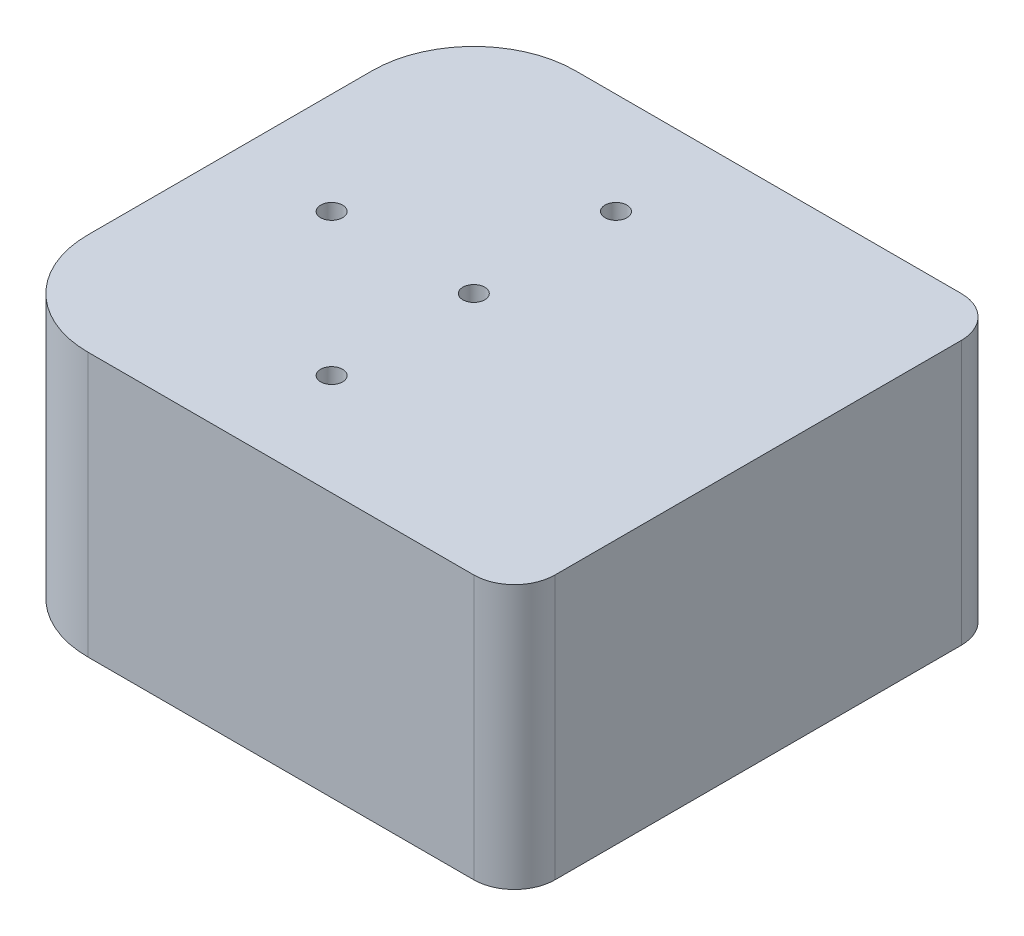
ISO-10303-21;
HEADER;
FILE_DESCRIPTION(('STEP AP214'),'2;1');
FILE_NAME('part.step','',(''),(''),'','','');
FILE_SCHEMA(('AUTOMOTIVE_DESIGN { 1 0 10303 214 1 1 1 1 }'));
ENDSEC;
DATA;
#1=APPLICATION_CONTEXT('core data for automotive mechanical design processes');
#2=APPLICATION_PROTOCOL_DEFINITION('international standard','automotive_design',2000,#1);
#3=PRODUCT_CONTEXT('',#1,'mechanical');
#4=PRODUCT('Part','Part','',(#3));
#5=PRODUCT_RELATED_PRODUCT_CATEGORY('part','',(#4));
#6=PRODUCT_DEFINITION_FORMATION('','',#4);
#7=PRODUCT_DEFINITION_CONTEXT('part definition',#1,'design');
#8=PRODUCT_DEFINITION('design','',#6,#7);
#9=PRODUCT_DEFINITION_SHAPE('','',#8);
#10=(LENGTH_UNIT() NAMED_UNIT(*) SI_UNIT(.MILLI.,.METRE.));
#11=(NAMED_UNIT(*) PLANE_ANGLE_UNIT() SI_UNIT($,.RADIAN.));
#12=(NAMED_UNIT(*) SI_UNIT($,.STERADIAN.) SOLID_ANGLE_UNIT());
#13=UNCERTAINTY_MEASURE_WITH_UNIT(LENGTH_MEASURE(1.E-05),#10,'distance_accuracy_value','');
#14=(GEOMETRIC_REPRESENTATION_CONTEXT(3) GLOBAL_UNCERTAINTY_ASSIGNED_CONTEXT((#13)) GLOBAL_UNIT_ASSIGNED_CONTEXT((#10,
#11,#12)) REPRESENTATION_CONTEXT('',''));
#15=CARTESIAN_POINT('',(0.,0.,0.));
#16=DIRECTION('',(0.,0.,1.));
#17=DIRECTION('',(1.,0.,0.));
#18=AXIS2_PLACEMENT_3D('',#15,#16,#17);
#19=CARTESIAN_POINT('',(-7.,13.,7.));
#20=DIRECTION('',(0.,-1.,0.));
#21=DIRECTION('',(0.,0.,-1.));
#22=AXIS2_PLACEMENT_3D('',#19,#20,#21);
#23=PLANE('',#22);
#24=CARTESIAN_POINT('',(0.,13.,-7.));
#25=DIRECTION('',(0.,1.,0.));
#26=DIRECTION('',(0.,0.,1.));
#27=AXIS2_PLACEMENT_3D('',#24,#25,#26);
#28=CIRCLE('',#27,0.54);
#29=CARTESIAN_POINT('',(0.,13.,-6.46));
#30=VERTEX_POINT('',#29);
#31=EDGE_CURVE('E188',#30,#30,#28,.T.);
#32=ORIENTED_EDGE('',*,*,#31,.F.);
#33=EDGE_LOOP('',(#32));
#34=FACE_BOUND('',#33,.T.);
#35=CARTESIAN_POINT('',(0.,13.,0.));
#36=DIRECTION('',(0.,1.,0.));
#37=DIRECTION('',(0.,0.,1.));
#38=AXIS2_PLACEMENT_3D('',#35,#36,#37);
#39=CIRCLE('',#38,0.54);
#40=CARTESIAN_POINT('',(0.,13.,0.54));
#41=VERTEX_POINT('',#40);
#42=EDGE_CURVE('E134',#41,#41,#39,.T.);
#43=ORIENTED_EDGE('',*,*,#42,.F.);
#44=EDGE_LOOP('',(#43));
#45=FACE_BOUND('',#44,.T.);
#46=CARTESIAN_POINT('',(-7.,13.,7.));
#47=DIRECTION('',(0.,1.,0.));
#48=DIRECTION('',(0.,0.,-1.));
#49=AXIS2_PLACEMENT_3D('',#46,#47,#48);
#50=CIRCLE('',#49,5.);
#51=CARTESIAN_POINT('',(-12.,13.,6.99999999999996));
#52=VERTEX_POINT('',#51);
#53=CARTESIAN_POINT('',(-6.99999999999996,13.,12.));
#54=VERTEX_POINT('',#53);
#55=EDGE_CURVE('E145',#52,#54,#50,.T.);
#56=ORIENTED_EDGE('',*,*,#55,.T.);
#57=DIRECTION('',(1.,0.,0.));
#58=VECTOR('',#57,1.);
#59=CARTESIAN_POINT('',(-6.99999999999996,13.,12.));
#60=LINE('',#59,#58);
#61=CARTESIAN_POINT('',(12.,13.,12.));
#62=VERTEX_POINT('',#61);
#63=EDGE_CURVE('E93',#54,#62,#60,.T.);
#64=ORIENTED_EDGE('',*,*,#63,.T.);
#65=CARTESIAN_POINT('',(12.,13.,10.));
#66=DIRECTION('',(0.,1.,0.));
#67=DIRECTION('',(0.,0.,1.));
#68=AXIS2_PLACEMENT_3D('',#65,#66,#67);
#69=CIRCLE('',#68,2.);
#70=CARTESIAN_POINT('',(14.,13.,9.99999999999998));
#71=VERTEX_POINT('',#70);
#72=EDGE_CURVE('E160',#62,#71,#69,.T.);
#73=ORIENTED_EDGE('',*,*,#72,.T.);
#74=DIRECTION('',(0.,0.,-1.));
#75=VECTOR('',#74,1.);
#76=CARTESIAN_POINT('',(14.,13.,-9.99999999999999));
#77=LINE('',#76,#75);
#78=CARTESIAN_POINT('',(14.,13.,-9.99999999999999));
#79=VERTEX_POINT('',#78);
#80=EDGE_CURVE('E173',#71,#79,#77,.T.);
#81=ORIENTED_EDGE('',*,*,#80,.T.);
#82=CARTESIAN_POINT('',(12.,13.,-10.));
#83=DIRECTION('',(0.,1.,0.));
#84=DIRECTION('',(0.,0.,-1.));
#85=AXIS2_PLACEMENT_3D('',#82,#83,#84);
#86=CIRCLE('',#85,2.);
#87=CARTESIAN_POINT('',(12.,13.,-12.));
#88=VERTEX_POINT('',#87);
#89=EDGE_CURVE('E112',#79,#88,#86,.T.);
#90=ORIENTED_EDGE('',*,*,#89,.T.);
#91=DIRECTION('',(-1.,0.,0.));
#92=VECTOR('',#91,1.);
#93=CARTESIAN_POINT('',(-6.99999999999997,13.,-12.));
#94=LINE('',#93,#92);
#95=CARTESIAN_POINT('',(-6.99999999999997,13.,-12.));
#96=VERTEX_POINT('',#95);
#97=EDGE_CURVE('E106',#88,#96,#94,.T.);
#98=ORIENTED_EDGE('',*,*,#97,.T.);
#99=CARTESIAN_POINT('',(-7.,13.,-7.));
#100=DIRECTION('',(0.,1.,0.));
#101=DIRECTION('',(0.,0.,-1.));
#102=AXIS2_PLACEMENT_3D('',#99,#100,#101);
#103=CIRCLE('',#102,5.);
#104=CARTESIAN_POINT('',(-12.,13.,-6.99999999999996));
#105=VERTEX_POINT('',#104);
#106=EDGE_CURVE('E110',#96,#105,#103,.T.);
#107=ORIENTED_EDGE('',*,*,#106,.T.);
#108=DIRECTION('',(0.,0.,1.));
#109=VECTOR('',#108,1.);
#110=CARTESIAN_POINT('',(-12.,13.,-6.99999999999996));
#111=LINE('',#110,#109);
#112=EDGE_CURVE('E50',#105,#52,#111,.T.);
#113=ORIENTED_EDGE('',*,*,#112,.T.);
#114=EDGE_LOOP('',(#56,#64,#73,#81,#90,#98,#107,#113));
#115=FACE_BOUND('',#114,.T.);
#116=CARTESIAN_POINT('',(-7.,13.,0.));
#117=DIRECTION('',(0.,1.,0.));
#118=DIRECTION('',(0.,0.,1.));
#119=AXIS2_PLACEMENT_3D('',#116,#117,#118);
#120=CIRCLE('',#119,0.54);
#121=CARTESIAN_POINT('',(-7.,13.,0.540000000000001));
#122=VERTEX_POINT('',#121);
#123=EDGE_CURVE('E182',#122,#122,#120,.T.);
#124=ORIENTED_EDGE('',*,*,#123,.F.);
#125=EDGE_LOOP('',(#124));
#126=FACE_BOUND('',#125,.T.);
#127=CARTESIAN_POINT('',(0.,13.,7.));
#128=DIRECTION('',(0.,1.,0.));
#129=DIRECTION('',(0.,0.,1.));
#130=AXIS2_PLACEMENT_3D('',#127,#128,#129);
#131=CIRCLE('',#130,0.54);
#132=CARTESIAN_POINT('',(0.,13.,7.54));
#133=VERTEX_POINT('',#132);
#134=EDGE_CURVE('E194',#133,#133,#131,.T.);
#135=ORIENTED_EDGE('',*,*,#134,.F.);
#136=EDGE_LOOP('',(#135));
#137=FACE_BOUND('',#136,.T.);
#138=ADVANCED_FACE('F33',(#34,#45,#115,#126,#137),#23,.F.);
#139=CARTESIAN_POINT('',(-7.,0.,7.));
#140=DIRECTION('',(0.,-1.,0.));
#141=DIRECTION('',(0.,0.,-1.));
#142=AXIS2_PLACEMENT_3D('',#139,#140,#141);
#143=PLANE('',#142);
#144=CARTESIAN_POINT('',(0.,0.,-7.));
#145=DIRECTION('',(0.,1.,0.));
#146=DIRECTION('',(0.,0.,1.));
#147=AXIS2_PLACEMENT_3D('',#144,#145,#146);
#148=CIRCLE('',#147,0.54);
#149=CARTESIAN_POINT('',(0.,0.,-6.46));
#150=VERTEX_POINT('',#149);
#151=EDGE_CURVE('E191',#150,#150,#148,.T.);
#152=ORIENTED_EDGE('',*,*,#151,.T.);
#153=EDGE_LOOP('',(#152));
#154=FACE_BOUND('',#153,.T.);
#155=CARTESIAN_POINT('',(0.,0.,0.));
#156=DIRECTION('',(0.,1.,0.));
#157=DIRECTION('',(0.,0.,1.));
#158=AXIS2_PLACEMENT_3D('',#155,#156,#157);
#159=CIRCLE('',#158,0.54);
#160=CARTESIAN_POINT('',(0.,0.,0.54));
#161=VERTEX_POINT('',#160);
#162=EDGE_CURVE('E179',#161,#161,#159,.T.);
#163=ORIENTED_EDGE('',*,*,#162,.T.);
#164=EDGE_LOOP('',(#163));
#165=FACE_BOUND('',#164,.T.);
#166=CARTESIAN_POINT('',(-7.,0.,7.));
#167=DIRECTION('',(0.,1.,0.));
#168=DIRECTION('',(0.,0.,-1.));
#169=AXIS2_PLACEMENT_3D('',#166,#167,#168);
#170=CIRCLE('',#169,5.);
#171=CARTESIAN_POINT('',(-12.,0.,6.99999999999996));
#172=VERTEX_POINT('',#171);
#173=CARTESIAN_POINT('',(-6.99999999999996,0.,12.));
#174=VERTEX_POINT('',#173);
#175=EDGE_CURVE('E130',#172,#174,#170,.T.);
#176=ORIENTED_EDGE('',*,*,#175,.F.);
#177=DIRECTION('',(0.,0.,1.));
#178=VECTOR('',#177,1.);
#179=CARTESIAN_POINT('',(-12.,0.,-6.99999999999996));
#180=LINE('',#179,#178);
#181=CARTESIAN_POINT('',(-12.,0.,-6.99999999999996));
#182=VERTEX_POINT('',#181);
#183=EDGE_CURVE('E85',#182,#172,#180,.T.);
#184=ORIENTED_EDGE('',*,*,#183,.F.);
#185=CARTESIAN_POINT('',(-7.,0.,-7.));
#186=DIRECTION('',(0.,1.,0.));
#187=DIRECTION('',(0.,0.,-1.));
#188=AXIS2_PLACEMENT_3D('',#185,#186,#187);
#189=CIRCLE('',#188,5.);
#190=CARTESIAN_POINT('',(-6.99999999999997,0.,-12.));
#191=VERTEX_POINT('',#190);
#192=EDGE_CURVE('E79',#191,#182,#189,.T.);
#193=ORIENTED_EDGE('',*,*,#192,.F.);
#194=DIRECTION('',(-1.,0.,0.));
#195=VECTOR('',#194,1.);
#196=CARTESIAN_POINT('',(-6.99999999999997,0.,-12.));
#197=LINE('',#196,#195);
#198=CARTESIAN_POINT('',(12.,0.,-12.));
#199=VERTEX_POINT('',#198);
#200=EDGE_CURVE('E120',#199,#191,#197,.T.);
#201=ORIENTED_EDGE('',*,*,#200,.F.);
#202=CARTESIAN_POINT('',(12.,0.,-10.));
#203=DIRECTION('',(0.,1.,0.));
#204=DIRECTION('',(0.,0.,-1.));
#205=AXIS2_PLACEMENT_3D('',#202,#203,#204);
#206=CIRCLE('',#205,2.);
#207=CARTESIAN_POINT('',(14.,0.,-9.99999999999999));
#208=VERTEX_POINT('',#207);
#209=EDGE_CURVE('E140',#208,#199,#206,.T.);
#210=ORIENTED_EDGE('',*,*,#209,.F.);
#211=DIRECTION('',(0.,0.,-1.));
#212=VECTOR('',#211,1.);
#213=CARTESIAN_POINT('',(14.,0.,-9.99999999999999));
#214=LINE('',#213,#212);
#215=CARTESIAN_POINT('',(14.,0.,9.99999999999998));
#216=VERTEX_POINT('',#215);
#217=EDGE_CURVE('E138',#216,#208,#214,.T.);
#218=ORIENTED_EDGE('',*,*,#217,.F.);
#219=CARTESIAN_POINT('',(12.,0.,10.));
#220=DIRECTION('',(0.,1.,0.));
#221=DIRECTION('',(0.,0.,1.));
#222=AXIS2_PLACEMENT_3D('',#219,#220,#221);
#223=CIRCLE('',#222,2.);
#224=CARTESIAN_POINT('',(12.,0.,12.));
#225=VERTEX_POINT('',#224);
#226=EDGE_CURVE('E136',#225,#216,#223,.T.);
#227=ORIENTED_EDGE('',*,*,#226,.F.);
#228=DIRECTION('',(1.,0.,0.));
#229=VECTOR('',#228,1.);
#230=CARTESIAN_POINT('',(-6.99999999999996,0.,12.));
#231=LINE('',#230,#229);
#232=EDGE_CURVE('E133',#174,#225,#231,.T.);
#233=ORIENTED_EDGE('',*,*,#232,.F.);
#234=EDGE_LOOP('',(#176,#184,#193,#201,#210,#218,#227,#233));
#235=FACE_BOUND('',#234,.T.);
#236=CARTESIAN_POINT('',(-7.,0.,0.));
#237=DIRECTION('',(0.,1.,0.));
#238=DIRECTION('',(0.,0.,1.));
#239=AXIS2_PLACEMENT_3D('',#236,#237,#238);
#240=CIRCLE('',#239,0.54);
#241=CARTESIAN_POINT('',(-7.,0.,0.540000000000001));
#242=VERTEX_POINT('',#241);
#243=EDGE_CURVE('E185',#242,#242,#240,.T.);
#244=ORIENTED_EDGE('',*,*,#243,.T.);
#245=EDGE_LOOP('',(#244));
#246=FACE_BOUND('',#245,.T.);
#247=CARTESIAN_POINT('',(0.,0.,7.));
#248=DIRECTION('',(0.,1.,0.));
#249=DIRECTION('',(0.,0.,1.));
#250=AXIS2_PLACEMENT_3D('',#247,#248,#249);
#251=CIRCLE('',#250,0.54);
#252=CARTESIAN_POINT('',(0.,0.,7.54));
#253=VERTEX_POINT('',#252);
#254=EDGE_CURVE('E197',#253,#253,#251,.T.);
#255=ORIENTED_EDGE('',*,*,#254,.T.);
#256=EDGE_LOOP('',(#255));
#257=FACE_BOUND('',#256,.T.);
#258=ADVANCED_FACE('F164',(#154,#165,#235,#246,#257),#143,.T.);
#259=CARTESIAN_POINT('',(-7.,13.,7.));
#260=DIRECTION('',(0.,-1.,0.));
#261=DIRECTION('',(0.,0.,-1.));
#262=AXIS2_PLACEMENT_3D('',#259,#260,#261);
#263=CYLINDRICAL_SURFACE('',#262,5.);
#264=ORIENTED_EDGE('',*,*,#175,.T.);
#265=DIRECTION('',(0.,-1.,0.));
#266=VECTOR('',#265,1.);
#267=CARTESIAN_POINT('',(-6.99999999999996,13.,12.));
#268=LINE('',#267,#266);
#269=EDGE_CURVE('E11',#54,#174,#268,.T.);
#270=ORIENTED_EDGE('',*,*,#269,.F.);
#271=ORIENTED_EDGE('',*,*,#55,.F.);
#272=DIRECTION('',(0.,-1.,0.));
#273=VECTOR('',#272,1.);
#274=CARTESIAN_POINT('',(-12.,13.,6.99999999999996));
#275=LINE('',#274,#273);
#276=EDGE_CURVE('E126',#52,#172,#275,.T.);
#277=ORIENTED_EDGE('',*,*,#276,.T.);
#278=EDGE_LOOP('',(#264,#270,#271,#277));
#279=FACE_BOUND('',#278,.T.);
#280=ADVANCED_FACE('F35',(#279),#263,.T.);
#281=CARTESIAN_POINT('',(-6.99999999999996,13.,12.));
#282=DIRECTION('',(0.,0.,-1.));
#283=DIRECTION('',(-1.,0.,0.));
#284=AXIS2_PLACEMENT_3D('',#281,#282,#283);
#285=PLANE('',#284);
#286=ORIENTED_EDGE('',*,*,#232,.T.);
#287=DIRECTION('',(0.,-1.,0.));
#288=VECTOR('',#287,1.);
#289=CARTESIAN_POINT('',(12.,13.,12.));
#290=LINE('',#289,#288);
#291=EDGE_CURVE('E42',#62,#225,#290,.T.);
#292=ORIENTED_EDGE('',*,*,#291,.F.);
#293=ORIENTED_EDGE('',*,*,#63,.F.);
#294=ORIENTED_EDGE('',*,*,#269,.T.);
#295=EDGE_LOOP('',(#286,#292,#293,#294));
#296=FACE_BOUND('',#295,.T.);
#297=ADVANCED_FACE('F232',(#296),#285,.F.);
#298=CARTESIAN_POINT('',(12.,13.,10.));
#299=DIRECTION('',(0.,-1.,0.));
#300=DIRECTION('',(0.,0.,-1.));
#301=AXIS2_PLACEMENT_3D('',#298,#299,#300);
#302=CYLINDRICAL_SURFACE('',#301,2.);
#303=ORIENTED_EDGE('',*,*,#226,.T.);
#304=DIRECTION('',(0.,-1.,0.));
#305=VECTOR('',#304,1.);
#306=CARTESIAN_POINT('',(14.,13.,9.99999999999998));
#307=LINE('',#306,#305);
#308=EDGE_CURVE('E152',#71,#216,#307,.T.);
#309=ORIENTED_EDGE('',*,*,#308,.F.);
#310=ORIENTED_EDGE('',*,*,#72,.F.);
#311=ORIENTED_EDGE('',*,*,#291,.T.);
#312=EDGE_LOOP('',(#303,#309,#310,#311));
#313=FACE_BOUND('',#312,.T.);
#314=ADVANCED_FACE('F158',(#313),#302,.T.);
#315=CARTESIAN_POINT('',(14.,13.,-9.99999999999999));
#316=DIRECTION('',(-1.,0.,0.));
#317=DIRECTION('',(0.,0.,1.));
#318=AXIS2_PLACEMENT_3D('',#315,#316,#317);
#319=PLANE('',#318);
#320=ORIENTED_EDGE('',*,*,#217,.T.);
#321=DIRECTION('',(0.,-1.,0.));
#322=VECTOR('',#321,1.);
#323=CARTESIAN_POINT('',(14.,13.,-9.99999999999999));
#324=LINE('',#323,#322);
#325=EDGE_CURVE('E149',#79,#208,#324,.T.);
#326=ORIENTED_EDGE('',*,*,#325,.F.);
#327=ORIENTED_EDGE('',*,*,#80,.F.);
#328=ORIENTED_EDGE('',*,*,#308,.T.);
#329=EDGE_LOOP('',(#320,#326,#327,#328));
#330=FACE_BOUND('',#329,.T.);
#331=ADVANCED_FACE('F169',(#330),#319,.F.);
#332=CARTESIAN_POINT('',(12.,13.,-10.));
#333=DIRECTION('',(0.,-1.,0.));
#334=DIRECTION('',(0.,0.,-1.));
#335=AXIS2_PLACEMENT_3D('',#332,#333,#334);
#336=CYLINDRICAL_SURFACE('',#335,2.);
#337=ORIENTED_EDGE('',*,*,#209,.T.);
#338=DIRECTION('',(0.,-1.,0.));
#339=VECTOR('',#338,1.);
#340=CARTESIAN_POINT('',(12.,13.,-12.));
#341=LINE('',#340,#339);
#342=EDGE_CURVE('E121',#88,#199,#341,.T.);
#343=ORIENTED_EDGE('',*,*,#342,.F.);
#344=ORIENTED_EDGE('',*,*,#89,.F.);
#345=ORIENTED_EDGE('',*,*,#325,.T.);
#346=EDGE_LOOP('',(#337,#343,#344,#345));
#347=FACE_BOUND('',#346,.T.);
#348=ADVANCED_FACE('F172',(#347),#336,.T.);
#349=CARTESIAN_POINT('',(-6.99999999999997,13.,-12.));
#350=DIRECTION('',(0.,0.,1.));
#351=DIRECTION('',(1.,0.,0.));
#352=AXIS2_PLACEMENT_3D('',#349,#350,#351);
#353=PLANE('',#352);
#354=ORIENTED_EDGE('',*,*,#200,.T.);
#355=DIRECTION('',(0.,-1.,0.));
#356=VECTOR('',#355,1.);
#357=CARTESIAN_POINT('',(-6.99999999999997,13.,-12.));
#358=LINE('',#357,#356);
#359=EDGE_CURVE('E117',#96,#191,#358,.T.);
#360=ORIENTED_EDGE('',*,*,#359,.F.);
#361=ORIENTED_EDGE('',*,*,#97,.F.);
#362=ORIENTED_EDGE('',*,*,#342,.T.);
#363=EDGE_LOOP('',(#354,#360,#361,#362));
#364=FACE_BOUND('',#363,.T.);
#365=ADVANCED_FACE('F118',(#364),#353,.F.);
#366=CARTESIAN_POINT('',(-7.,13.,-7.));
#367=DIRECTION('',(0.,-1.,0.));
#368=DIRECTION('',(0.,0.,-1.));
#369=AXIS2_PLACEMENT_3D('',#366,#367,#368);
#370=CYLINDRICAL_SURFACE('',#369,5.);
#371=ORIENTED_EDGE('',*,*,#192,.T.);
#372=DIRECTION('',(0.,-1.,0.));
#373=VECTOR('',#372,1.);
#374=CARTESIAN_POINT('',(-12.,13.,-6.99999999999996));
#375=LINE('',#374,#373);
#376=EDGE_CURVE('E122',#105,#182,#375,.T.);
#377=ORIENTED_EDGE('',*,*,#376,.F.);
#378=ORIENTED_EDGE('',*,*,#106,.F.);
#379=ORIENTED_EDGE('',*,*,#359,.T.);
#380=EDGE_LOOP('',(#371,#377,#378,#379));
#381=FACE_BOUND('',#380,.T.);
#382=ADVANCED_FACE('F124',(#381),#370,.T.);
#383=CARTESIAN_POINT('',(-12.,13.,-6.99999999999996));
#384=DIRECTION('',(1.,0.,0.));
#385=DIRECTION('',(0.,0.,-1.));
#386=AXIS2_PLACEMENT_3D('',#383,#384,#385);
#387=PLANE('',#386);
#388=ORIENTED_EDGE('',*,*,#183,.T.);
#389=ORIENTED_EDGE('',*,*,#276,.F.);
#390=ORIENTED_EDGE('',*,*,#112,.F.);
#391=ORIENTED_EDGE('',*,*,#376,.T.);
#392=EDGE_LOOP('',(#388,#389,#390,#391));
#393=FACE_BOUND('',#392,.T.);
#394=ADVANCED_FACE('F220',(#393),#387,.F.);
#395=CARTESIAN_POINT('',(0.,13.,0.));
#396=DIRECTION('',(0.,-1.,0.));
#397=DIRECTION('',(0.,0.,-1.));
#398=AXIS2_PLACEMENT_3D('',#395,#396,#397);
#399=CYLINDRICAL_SURFACE('',#398,0.54);
#400=ORIENTED_EDGE('',*,*,#42,.T.);
#401=EDGE_LOOP('',(#400));
#402=FACE_BOUND('',#401,.T.);
#403=ORIENTED_EDGE('',*,*,#162,.F.);
#404=EDGE_LOOP('',(#403));
#405=FACE_BOUND('',#404,.T.);
#406=ADVANCED_FACE('F217',(#402,#405),#399,.F.);
#407=CARTESIAN_POINT('',(-7.,13.,0.));
#408=DIRECTION('',(0.,-1.,0.));
#409=DIRECTION('',(0.,0.,-1.));
#410=AXIS2_PLACEMENT_3D('',#407,#408,#409);
#411=CYLINDRICAL_SURFACE('',#410,0.54);
#412=ORIENTED_EDGE('',*,*,#123,.T.);
#413=EDGE_LOOP('',(#412));
#414=FACE_BOUND('',#413,.T.);
#415=ORIENTED_EDGE('',*,*,#243,.F.);
#416=EDGE_LOOP('',(#415));
#417=FACE_BOUND('',#416,.T.);
#418=ADVANCED_FACE('F296',(#414,#417),#411,.F.);
#419=CARTESIAN_POINT('',(0.,13.,-7.));
#420=DIRECTION('',(0.,-1.,0.));
#421=DIRECTION('',(0.,0.,-1.));
#422=AXIS2_PLACEMENT_3D('',#419,#420,#421);
#423=CYLINDRICAL_SURFACE('',#422,0.54);
#424=ORIENTED_EDGE('',*,*,#31,.T.);
#425=EDGE_LOOP('',(#424));
#426=FACE_BOUND('',#425,.T.);
#427=ORIENTED_EDGE('',*,*,#151,.F.);
#428=EDGE_LOOP('',(#427));
#429=FACE_BOUND('',#428,.T.);
#430=ADVANCED_FACE('F304',(#426,#429),#423,.F.);
#431=CARTESIAN_POINT('',(0.,13.,7.));
#432=DIRECTION('',(0.,-1.,0.));
#433=DIRECTION('',(0.,0.,-1.));
#434=AXIS2_PLACEMENT_3D('',#431,#432,#433);
#435=CYLINDRICAL_SURFACE('',#434,0.54);
#436=ORIENTED_EDGE('',*,*,#134,.T.);
#437=EDGE_LOOP('',(#436));
#438=FACE_BOUND('',#437,.T.);
#439=ORIENTED_EDGE('',*,*,#254,.F.);
#440=EDGE_LOOP('',(#439));
#441=FACE_BOUND('',#440,.T.);
#442=ADVANCED_FACE('F203',(#438,#441),#435,.F.);
#443=CLOSED_SHELL('',(#138,#258,#280,#297,#314,#331,#348,#365,#382,#394,#406,#418,#430,#442));
#444=MANIFOLD_SOLID_BREP('B2',#443);
#445=ADVANCED_BREP_SHAPE_REPRESENTATION('',(#18,#444),#14);
#446=SHAPE_DEFINITION_REPRESENTATION(#9,#445);
ENDSEC;
END-ISO-10303-21;
